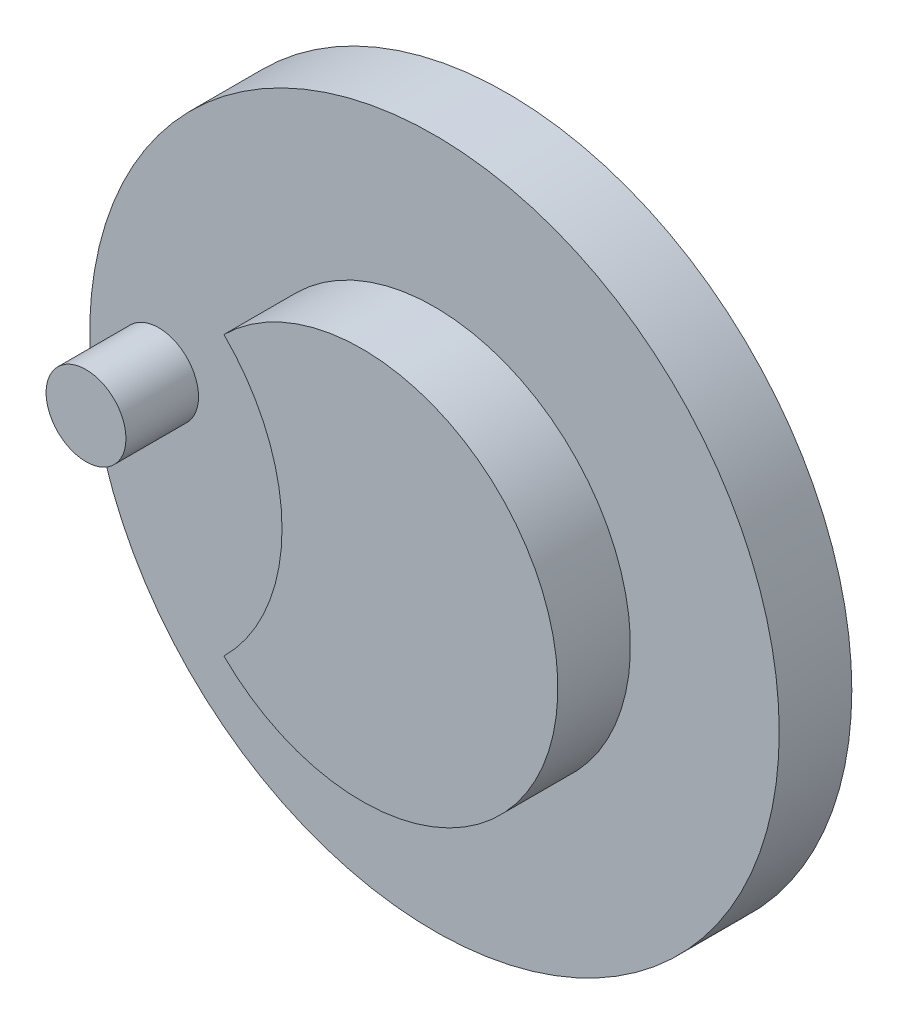
ISO-10303-21;
HEADER;
FILE_DESCRIPTION(('STEP AP214'),'2;1');
FILE_NAME('part.step','',(''),(''),'','','');
FILE_SCHEMA(('AUTOMOTIVE_DESIGN { 1 0 10303 214 1 1 1 1 }'));
ENDSEC;
DATA;
#1=APPLICATION_CONTEXT('core data for automotive mechanical design processes');
#2=APPLICATION_PROTOCOL_DEFINITION('international standard','automotive_design',2000,#1);
#3=PRODUCT_CONTEXT('',#1,'mechanical');
#4=PRODUCT('Part','Part','',(#3));
#5=PRODUCT_RELATED_PRODUCT_CATEGORY('part','',(#4));
#6=PRODUCT_DEFINITION_FORMATION('','',#4);
#7=PRODUCT_DEFINITION_CONTEXT('part definition',#1,'design');
#8=PRODUCT_DEFINITION('design','',#6,#7);
#9=PRODUCT_DEFINITION_SHAPE('','',#8);
#10=(LENGTH_UNIT() NAMED_UNIT(*) SI_UNIT(.MILLI.,.METRE.));
#11=(NAMED_UNIT(*) PLANE_ANGLE_UNIT() SI_UNIT($,.RADIAN.));
#12=(NAMED_UNIT(*) SI_UNIT($,.STERADIAN.) SOLID_ANGLE_UNIT());
#13=UNCERTAINTY_MEASURE_WITH_UNIT(LENGTH_MEASURE(1.E-05),#10,'distance_accuracy_value','');
#14=(GEOMETRIC_REPRESENTATION_CONTEXT(3) GLOBAL_UNCERTAINTY_ASSIGNED_CONTEXT((#13)) GLOBAL_UNIT_ASSIGNED_CONTEXT((#10,
#11,#12)) REPRESENTATION_CONTEXT('',''));
#15=CARTESIAN_POINT('',(0.,0.,0.));
#16=DIRECTION('',(0.,0.,1.));
#17=DIRECTION('',(1.,0.,0.));
#18=AXIS2_PLACEMENT_3D('',#15,#16,#17);
#19=CARTESIAN_POINT('',(0.,0.,10.));
#20=DIRECTION('',(0.,0.,-1.));
#21=DIRECTION('',(-1.,0.,0.));
#22=AXIS2_PLACEMENT_3D('',#19,#20,#21);
#23=CYLINDRICAL_SURFACE('',#22,47.5);
#24=CARTESIAN_POINT('',(0.,0.,10.));
#25=DIRECTION('',(0.,0.,1.));
#26=DIRECTION('',(1.,0.,0.));
#27=AXIS2_PLACEMENT_3D('',#24,#25,#26);
#28=CIRCLE('',#27,47.5);
#29=CARTESIAN_POINT('',(47.5,0.,10.));
#30=VERTEX_POINT('',#29);
#31=EDGE_CURVE('E93',#30,#30,#28,.T.);
#32=ORIENTED_EDGE('',*,*,#31,.F.);
#33=EDGE_LOOP('',(#32));
#34=FACE_BOUND('',#33,.T.);
#35=CARTESIAN_POINT('',(0.,0.,0.));
#36=DIRECTION('',(0.,0.,1.));
#37=DIRECTION('',(1.,0.,0.));
#38=AXIS2_PLACEMENT_3D('',#35,#36,#37);
#39=CIRCLE('',#38,47.5);
#40=CARTESIAN_POINT('',(47.5,0.,0.));
#41=VERTEX_POINT('',#40);
#42=EDGE_CURVE('E94',#41,#41,#39,.T.);
#43=ORIENTED_EDGE('',*,*,#42,.T.);
#44=EDGE_LOOP('',(#43));
#45=FACE_BOUND('',#44,.T.);
#46=ADVANCED_FACE('F43',(#34,#45),#23,.T.);
#47=CARTESIAN_POINT('',(0.,0.,10.));
#48=DIRECTION('',(0.,0.,1.));
#49=DIRECTION('',(1.,0.,0.));
#50=AXIS2_PLACEMENT_3D('',#47,#48,#49);
#51=PLANE('',#50);
#52=CARTESIAN_POINT('',(-38.,0.,10.));
#53=DIRECTION('',(0.,0.,1.));
#54=DIRECTION('',(1.,0.,0.));
#55=AXIS2_PLACEMENT_3D('',#52,#53,#54);
#56=CIRCLE('',#55,5.5);
#57=CARTESIAN_POINT('',(-32.5,0.,10.));
#58=VERTEX_POINT('',#57);
#59=EDGE_CURVE('E90',#58,#58,#56,.T.);
#60=ORIENTED_EDGE('',*,*,#59,.F.);
#61=EDGE_LOOP('',(#60));
#62=FACE_BOUND('',#61,.T.);
#63=ORIENTED_EDGE('',*,*,#31,.T.);
#64=EDGE_LOOP('',(#63));
#65=FACE_BOUND('',#64,.T.);
#66=CARTESIAN_POINT('',(0.,0.,10.));
#67=DIRECTION('',(0.,0.,1.));
#68=DIRECTION('',(1.,0.,0.));
#69=AXIS2_PLACEMENT_3D('',#66,#67,#68);
#70=CIRCLE('',#69,27.);
#71=CARTESIAN_POINT('',(-19.,-19.1833260932509,10.));
#72=VERTEX_POINT('',#71);
#73=CARTESIAN_POINT('',(-19.,19.1833260932509,10.));
#74=VERTEX_POINT('',#73);
#75=EDGE_CURVE('E56',#72,#74,#70,.T.);
#76=ORIENTED_EDGE('',*,*,#75,.F.);
#77=CARTESIAN_POINT('',(-38.,0.,10.));
#78=DIRECTION('',(0.,0.,1.));
#79=DIRECTION('',(1.,0.,0.));
#80=AXIS2_PLACEMENT_3D('',#77,#78,#79);
#81=CIRCLE('',#80,27.);
#82=EDGE_CURVE('E50',#72,#74,#81,.T.);
#83=ORIENTED_EDGE('',*,*,#82,.T.);
#84=EDGE_LOOP('',(#76,#83));
#85=FACE_BOUND('',#84,.T.);
#86=ADVANCED_FACE('F118',(#62,#65,#85),#51,.T.);
#87=CARTESIAN_POINT('',(0.,0.,0.));
#88=DIRECTION('',(0.,0.,1.));
#89=DIRECTION('',(1.,0.,0.));
#90=AXIS2_PLACEMENT_3D('',#87,#88,#89);
#91=PLANE('',#90);
#92=CARTESIAN_POINT('',(0.,0.,0.));
#93=DIRECTION('',(0.,0.,1.));
#94=DIRECTION('',(1.,0.,0.));
#95=AXIS2_PLACEMENT_3D('',#92,#93,#94);
#96=CIRCLE('',#95,5.);
#97=CARTESIAN_POINT('',(5.,0.,0.));
#98=VERTEX_POINT('',#97);
#99=EDGE_CURVE('E11',#98,#98,#96,.F.);
#100=ORIENTED_EDGE('',*,*,#99,.F.);
#101=EDGE_LOOP('',(#100));
#102=FACE_BOUND('',#101,.T.);
#103=ORIENTED_EDGE('',*,*,#42,.F.);
#104=EDGE_LOOP('',(#103));
#105=FACE_BOUND('',#104,.T.);
#106=ADVANCED_FACE('F123',(#102,#105),#91,.F.);
#107=CARTESIAN_POINT('',(-38.,0.,20.));
#108=DIRECTION('',(0.,0.,-1.));
#109=DIRECTION('',(-1.,0.,0.));
#110=AXIS2_PLACEMENT_3D('',#107,#108,#109);
#111=CYLINDRICAL_SURFACE('',#110,27.);
#112=DIRECTION('',(0.,0.,-1.));
#113=VECTOR('',#112,1.);
#114=CARTESIAN_POINT('',(-19.,19.1833260932509,20.));
#115=LINE('',#114,#113);
#116=CARTESIAN_POINT('',(-19.,19.1833260932509,20.));
#117=VERTEX_POINT('',#116);
#118=EDGE_CURVE('E75',#117,#74,#115,.T.);
#119=ORIENTED_EDGE('',*,*,#118,.T.);
#120=ORIENTED_EDGE('',*,*,#82,.F.);
#121=DIRECTION('',(0.,0.,-1.));
#122=VECTOR('',#121,1.);
#123=CARTESIAN_POINT('',(-19.,-19.1833260932509,20.));
#124=LINE('',#123,#122);
#125=CARTESIAN_POINT('',(-19.,-19.1833260932509,20.));
#126=VERTEX_POINT('',#125);
#127=EDGE_CURVE('E67',#126,#72,#124,.T.);
#128=ORIENTED_EDGE('',*,*,#127,.F.);
#129=CARTESIAN_POINT('',(-38.,0.,20.));
#130=DIRECTION('',(0.,0.,1.));
#131=DIRECTION('',(1.,0.,0.));
#132=AXIS2_PLACEMENT_3D('',#129,#130,#131);
#133=CIRCLE('',#132,27.);
#134=EDGE_CURVE('E72',#126,#117,#133,.T.);
#135=ORIENTED_EDGE('',*,*,#134,.T.);
#136=EDGE_LOOP('',(#119,#120,#128,#135));
#137=FACE_BOUND('',#136,.T.);
#138=ADVANCED_FACE('F70',(#137),#111,.F.);
#139=CARTESIAN_POINT('',(0.,0.,20.));
#140=DIRECTION('',(0.,0.,-1.));
#141=DIRECTION('',(-1.,0.,0.));
#142=AXIS2_PLACEMENT_3D('',#139,#140,#141);
#143=CYLINDRICAL_SURFACE('',#142,27.);
#144=ORIENTED_EDGE('',*,*,#75,.T.);
#145=ORIENTED_EDGE('',*,*,#118,.F.);
#146=CARTESIAN_POINT('',(0.,0.,20.));
#147=DIRECTION('',(0.,0.,1.));
#148=DIRECTION('',(1.,0.,0.));
#149=AXIS2_PLACEMENT_3D('',#146,#147,#148);
#150=CIRCLE('',#149,27.);
#151=EDGE_CURVE('E78',#126,#117,#150,.T.);
#152=ORIENTED_EDGE('',*,*,#151,.F.);
#153=ORIENTED_EDGE('',*,*,#127,.T.);
#154=EDGE_LOOP('',(#144,#145,#152,#153));
#155=FACE_BOUND('',#154,.T.);
#156=ADVANCED_FACE('F79',(#155),#143,.T.);
#157=CARTESIAN_POINT('',(0.,0.,20.));
#158=DIRECTION('',(0.,0.,1.));
#159=DIRECTION('',(1.,0.,0.));
#160=AXIS2_PLACEMENT_3D('',#157,#158,#159);
#161=PLANE('',#160);
#162=ORIENTED_EDGE('',*,*,#134,.F.);
#163=ORIENTED_EDGE('',*,*,#151,.T.);
#164=EDGE_LOOP('',(#162,#163));
#165=FACE_BOUND('',#164,.T.);
#166=ADVANCED_FACE('F82',(#165),#161,.T.);
#167=CARTESIAN_POINT('',(-38.,0.,20.));
#168=DIRECTION('',(0.,0.,-1.));
#169=DIRECTION('',(-1.,0.,0.));
#170=AXIS2_PLACEMENT_3D('',#167,#168,#169);
#171=CYLINDRICAL_SURFACE('',#170,5.5);
#172=ORIENTED_EDGE('',*,*,#59,.T.);
#173=EDGE_LOOP('',(#172));
#174=FACE_BOUND('',#173,.T.);
#175=CARTESIAN_POINT('',(-38.,0.,20.));
#176=DIRECTION('',(0.,0.,1.));
#177=DIRECTION('',(1.,0.,0.));
#178=AXIS2_PLACEMENT_3D('',#175,#176,#177);
#179=CIRCLE('',#178,5.5);
#180=CARTESIAN_POINT('',(-32.5,0.,20.));
#181=VERTEX_POINT('',#180);
#182=EDGE_CURVE('E74',#181,#181,#179,.T.);
#183=ORIENTED_EDGE('',*,*,#182,.F.);
#184=EDGE_LOOP('',(#183));
#185=FACE_BOUND('',#184,.T.);
#186=ADVANCED_FACE('F106',(#174,#185),#171,.T.);
#187=CARTESIAN_POINT('',(0.,0.,20.));
#188=DIRECTION('',(0.,0.,1.));
#189=DIRECTION('',(1.,0.,0.));
#190=AXIS2_PLACEMENT_3D('',#187,#188,#189);
#191=PLANE('',#190);
#192=ORIENTED_EDGE('',*,*,#182,.T.);
#193=EDGE_LOOP('',(#192));
#194=FACE_BOUND('',#193,.T.);
#195=ADVANCED_FACE('F104',(#194),#191,.T.);
#196=CARTESIAN_POINT('',(0.,0.,-10.));
#197=DIRECTION('',(0.,0.,1.));
#198=DIRECTION('',(1.,0.,0.));
#199=AXIS2_PLACEMENT_3D('',#196,#197,#198);
#200=CYLINDRICAL_SURFACE('',#199,5.);
#201=CARTESIAN_POINT('',(0.,0.,-10.));
#202=DIRECTION('',(0.,0.,-1.));
#203=DIRECTION('',(-1.,0.,0.));
#204=AXIS2_PLACEMENT_3D('',#201,#202,#203);
#205=CIRCLE('',#204,5.);
#206=CARTESIAN_POINT('',(-5.,0.,-10.));
#207=VERTEX_POINT('',#206);
#208=EDGE_CURVE('E83',#207,#207,#205,.T.);
#209=ORIENTED_EDGE('',*,*,#208,.F.);
#210=EDGE_LOOP('',(#209));
#211=FACE_BOUND('',#210,.T.);
#212=ORIENTED_EDGE('',*,*,#99,.T.);
#213=EDGE_LOOP('',(#212));
#214=FACE_BOUND('',#213,.T.);
#215=ADVANCED_FACE('F114',(#211,#214),#200,.T.);
#216=CARTESIAN_POINT('',(0.,0.,-10.));
#217=DIRECTION('',(0.,0.,-1.));
#218=DIRECTION('',(-1.,0.,0.));
#219=AXIS2_PLACEMENT_3D('',#216,#217,#218);
#220=PLANE('',#219);
#221=ORIENTED_EDGE('',*,*,#208,.T.);
#222=EDGE_LOOP('',(#221));
#223=FACE_BOUND('',#222,.T.);
#224=ADVANCED_FACE('F166',(#223),#220,.T.);
#225=CLOSED_SHELL('',(#46,#86,#106,#138,#156,#166,#186,#195,#215,#224));
#226=MANIFOLD_SOLID_BREP('B2',#225);
#227=ADVANCED_BREP_SHAPE_REPRESENTATION('',(#18,#226),#14);
#228=SHAPE_DEFINITION_REPRESENTATION(#9,#227);
ENDSEC;
END-ISO-10303-21;
